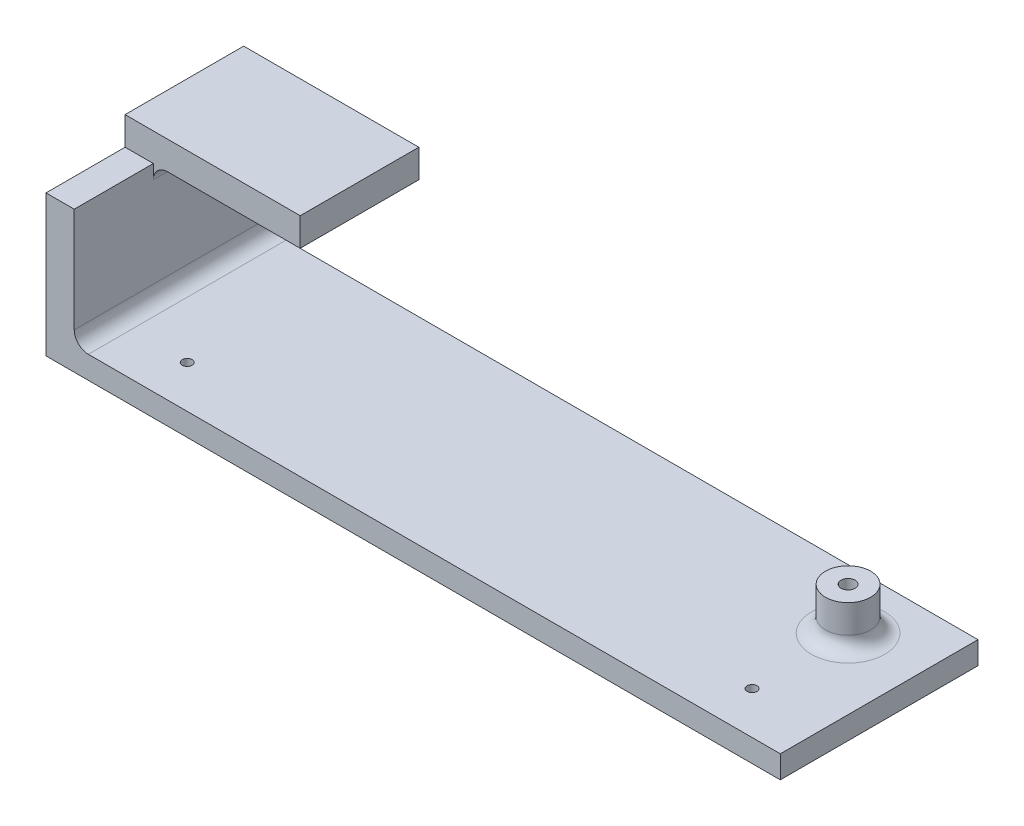
ISO-10303-21;
HEADER;
FILE_DESCRIPTION(('STEP AP214'),'2;1');
FILE_NAME('part.step','',(''),(''),'','','');
FILE_SCHEMA(('AUTOMOTIVE_DESIGN { 1 0 10303 214 1 1 1 1 }'));
ENDSEC;
DATA;
#1=APPLICATION_CONTEXT('core data for automotive mechanical design processes');
#2=APPLICATION_PROTOCOL_DEFINITION('international standard','automotive_design',2000,#1);
#3=PRODUCT_CONTEXT('',#1,'mechanical');
#4=PRODUCT('Part','Part','',(#3));
#5=PRODUCT_RELATED_PRODUCT_CATEGORY('part','',(#4));
#6=PRODUCT_DEFINITION_FORMATION('','',#4);
#7=PRODUCT_DEFINITION_CONTEXT('part definition',#1,'design');
#8=PRODUCT_DEFINITION('design','',#6,#7);
#9=PRODUCT_DEFINITION_SHAPE('','',#8);
#10=(LENGTH_UNIT() NAMED_UNIT(*) SI_UNIT(.MILLI.,.METRE.));
#11=(NAMED_UNIT(*) PLANE_ANGLE_UNIT() SI_UNIT($,.RADIAN.));
#12=(NAMED_UNIT(*) SI_UNIT($,.STERADIAN.) SOLID_ANGLE_UNIT());
#13=UNCERTAINTY_MEASURE_WITH_UNIT(LENGTH_MEASURE(1.E-05),#10,'distance_accuracy_value','');
#14=(GEOMETRIC_REPRESENTATION_CONTEXT(3) GLOBAL_UNCERTAINTY_ASSIGNED_CONTEXT((#13)) GLOBAL_UNIT_ASSIGNED_CONTEXT((#10,
#11,#12)) REPRESENTATION_CONTEXT('',''));
#15=CARTESIAN_POINT('',(0.,0.,0.));
#16=DIRECTION('',(0.,0.,1.));
#17=DIRECTION('',(1.,0.,0.));
#18=AXIS2_PLACEMENT_3D('',#15,#16,#17);
#19=CARTESIAN_POINT('',(0.,50.,0.));
#20=DIRECTION('',(0.,1.,0.));
#21=DIRECTION('',(0.,0.,1.));
#22=AXIS2_PLACEMENT_3D('',#19,#20,#21);
#23=PLANE('',#22);
#24=DIRECTION('',(0.,0.,1.));
#25=VECTOR('',#24,1.);
#26=CARTESIAN_POINT('',(0.,50.,0.));
#27=LINE('',#26,#25);
#28=CARTESIAN_POINT('',(0.,50.,-28.));
#29=VERTEX_POINT('',#28);
#30=CARTESIAN_POINT('',(0.,50.,0.));
#31=VERTEX_POINT('',#30);
#32=EDGE_CURVE('E187',#29,#31,#27,.T.);
#33=ORIENTED_EDGE('',*,*,#32,.F.);
#34=DIRECTION('',(-1.,0.,0.));
#35=VECTOR('',#34,1.);
#36=CARTESIAN_POINT('',(52.,50.,-28.));
#37=LINE('',#36,#35);
#38=CARTESIAN_POINT('',(-10.,50.,-28.));
#39=VERTEX_POINT('',#38);
#40=EDGE_CURVE('E177',#29,#39,#37,.T.);
#41=ORIENTED_EDGE('',*,*,#40,.T.);
#42=DIRECTION('',(0.,0.,-1.));
#43=VECTOR('',#42,1.);
#44=CARTESIAN_POINT('',(-10.,50.,-70.));
#45=LINE('',#44,#43);
#46=CARTESIAN_POINT('',(-10.,50.,0.));
#47=VERTEX_POINT('',#46);
#48=EDGE_CURVE('E183',#47,#39,#45,.T.);
#49=ORIENTED_EDGE('',*,*,#48,.F.);
#50=DIRECTION('',(-1.,0.,0.));
#51=VECTOR('',#50,1.);
#52=CARTESIAN_POINT('',(-10.,50.,0.));
#53=LINE('',#52,#51);
#54=EDGE_CURVE('E179',#31,#47,#53,.T.);
#55=ORIENTED_EDGE('',*,*,#54,.F.);
#56=EDGE_LOOP('',(#33,#41,#49,#55));
#57=FACE_BOUND('',#56,.T.);
#58=ADVANCED_FACE('F39',(#57),#23,.T.);
#59=CARTESIAN_POINT('',(0.,8.,0.));
#60=DIRECTION('',(0.,0.,-1.));
#61=DIRECTION('',(-1.,0.,0.));
#62=AXIS2_PLACEMENT_3D('',#59,#60,#61);
#63=PLANE('',#62);
#64=DIRECTION('',(1.,0.,0.));
#65=VECTOR('',#64,1.);
#66=CARTESIAN_POINT('',(0.,0.,0.));
#67=LINE('',#66,#65);
#68=CARTESIAN_POINT('',(-10.,0.,0.));
#69=VERTEX_POINT('',#68);
#70=CARTESIAN_POINT('',(250.,0.,0.));
#71=VERTEX_POINT('',#70);
#72=EDGE_CURVE('E214',#69,#71,#67,.T.);
#73=ORIENTED_EDGE('',*,*,#72,.T.);
#74=DIRECTION('',(0.,-1.,0.));
#75=VECTOR('',#74,1.);
#76=CARTESIAN_POINT('',(250.,8.,0.));
#77=LINE('',#76,#75);
#78=CARTESIAN_POINT('',(250.,8.,0.));
#79=VERTEX_POINT('',#78);
#80=EDGE_CURVE('E248',#79,#71,#77,.T.);
#81=ORIENTED_EDGE('',*,*,#80,.F.);
#82=DIRECTION('',(1.,0.,0.));
#83=VECTOR('',#82,1.);
#84=CARTESIAN_POINT('',(0.,8.,0.));
#85=LINE('',#84,#83);
#86=CARTESIAN_POINT('',(5.,8.,0.));
#87=VERTEX_POINT('',#86);
#88=EDGE_CURVE('E226',#87,#79,#85,.T.);
#89=ORIENTED_EDGE('',*,*,#88,.F.);
#90=CARTESIAN_POINT('',(5.,13.,0.));
#91=DIRECTION('',(0.,0.,-1.));
#92=DIRECTION('',(-1.,0.,0.));
#93=AXIS2_PLACEMENT_3D('',#90,#91,#92);
#94=CIRCLE('',#93,5.);
#95=CARTESIAN_POINT('',(0.,13.,0.));
#96=VERTEX_POINT('',#95);
#97=EDGE_CURVE('E268',#87,#96,#94,.T.);
#98=ORIENTED_EDGE('',*,*,#97,.T.);
#99=DIRECTION('',(0.,-1.,0.));
#100=VECTOR('',#99,1.);
#101=CARTESIAN_POINT('',(0.,50.,0.));
#102=LINE('',#101,#100);
#103=EDGE_CURVE('E194',#31,#96,#102,.T.);
#104=ORIENTED_EDGE('',*,*,#103,.F.);
#105=ORIENTED_EDGE('',*,*,#54,.T.);
#106=DIRECTION('',(0.,-1.,0.));
#107=VECTOR('',#106,1.);
#108=CARTESIAN_POINT('',(-10.,50.,0.));
#109=LINE('',#108,#107);
#110=EDGE_CURVE('E190',#47,#69,#109,.T.);
#111=ORIENTED_EDGE('',*,*,#110,.T.);
#112=EDGE_LOOP('',(#73,#81,#89,#98,#104,#105,#111));
#113=FACE_BOUND('',#112,.T.);
#114=ADVANCED_FACE('F297',(#113),#63,.F.);
#115=CARTESIAN_POINT('',(250.,8.,0.));
#116=DIRECTION('',(-1.,0.,0.));
#117=DIRECTION('',(0.,0.,1.));
#118=AXIS2_PLACEMENT_3D('',#115,#116,#117);
#119=PLANE('',#118);
#120=DIRECTION('',(0.,0.,-1.));
#121=VECTOR('',#120,1.);
#122=CARTESIAN_POINT('',(250.,0.,0.));
#123=LINE('',#122,#121);
#124=CARTESIAN_POINT('',(250.,0.,-70.));
#125=VERTEX_POINT('',#124);
#126=EDGE_CURVE('E240',#71,#125,#123,.T.);
#127=ORIENTED_EDGE('',*,*,#126,.T.);
#128=DIRECTION('',(0.,-1.,0.));
#129=VECTOR('',#128,1.);
#130=CARTESIAN_POINT('',(250.,8.,-70.));
#131=LINE('',#130,#129);
#132=CARTESIAN_POINT('',(250.,8.,-70.));
#133=VERTEX_POINT('',#132);
#134=EDGE_CURVE('E237',#133,#125,#131,.T.);
#135=ORIENTED_EDGE('',*,*,#134,.F.);
#136=DIRECTION('',(0.,0.,-1.));
#137=VECTOR('',#136,1.);
#138=CARTESIAN_POINT('',(250.,8.,0.));
#139=LINE('',#138,#137);
#140=EDGE_CURVE('E229',#79,#133,#139,.T.);
#141=ORIENTED_EDGE('',*,*,#140,.F.);
#142=ORIENTED_EDGE('',*,*,#80,.T.);
#143=EDGE_LOOP('',(#127,#135,#141,#142));
#144=FACE_BOUND('',#143,.T.);
#145=ADVANCED_FACE('F303',(#144),#119,.F.);
#146=CARTESIAN_POINT('',(0.,8.,-70.));
#147=DIRECTION('',(0.,0.,1.));
#148=DIRECTION('',(1.,0.,0.));
#149=AXIS2_PLACEMENT_3D('',#146,#147,#148);
#150=PLANE('',#149);
#151=DIRECTION('',(-1.,0.,0.));
#152=VECTOR('',#151,1.);
#153=CARTESIAN_POINT('',(0.,0.,-70.));
#154=LINE('',#153,#152);
#155=CARTESIAN_POINT('',(-10.,0.,-70.));
#156=VERTEX_POINT('',#155);
#157=EDGE_CURVE('E230',#125,#156,#154,.T.);
#158=ORIENTED_EDGE('',*,*,#157,.T.);
#159=DIRECTION('',(0.,-1.,0.));
#160=VECTOR('',#159,1.);
#161=CARTESIAN_POINT('',(-10.,50.,-70.));
#162=LINE('',#161,#160);
#163=CARTESIAN_POINT('',(-10.,60.,-70.));
#164=VERTEX_POINT('',#163);
#165=EDGE_CURVE('E203',#164,#156,#162,.T.);
#166=ORIENTED_EDGE('',*,*,#165,.F.);
#167=DIRECTION('',(-1.,0.,0.));
#168=VECTOR('',#167,1.);
#169=CARTESIAN_POINT('',(52.,60.,-70.));
#170=LINE('',#169,#168);
#171=CARTESIAN_POINT('',(52.,60.,-70.));
#172=VERTEX_POINT('',#171);
#173=EDGE_CURVE('E151',#172,#164,#170,.T.);
#174=ORIENTED_EDGE('',*,*,#173,.F.);
#175=DIRECTION('',(0.,-1.,0.));
#176=VECTOR('',#175,1.);
#177=CARTESIAN_POINT('',(52.,50.,-70.));
#178=LINE('',#177,#176);
#179=CARTESIAN_POINT('',(52.,50.,-70.));
#180=VERTEX_POINT('',#179);
#181=EDGE_CURVE('E143',#172,#180,#178,.T.);
#182=ORIENTED_EDGE('',*,*,#181,.T.);
#183=DIRECTION('',(-1.,0.,0.));
#184=VECTOR('',#183,1.);
#185=CARTESIAN_POINT('',(52.,50.,-70.));
#186=LINE('',#185,#184);
#187=CARTESIAN_POINT('',(5.,50.,-70.));
#188=VERTEX_POINT('',#187);
#189=EDGE_CURVE('E127',#180,#188,#186,.T.);
#190=ORIENTED_EDGE('',*,*,#189,.T.);
#191=CARTESIAN_POINT('',(5.,45.,-70.));
#192=DIRECTION('',(0.,0.,1.));
#193=DIRECTION('',(1.,0.,0.));
#194=AXIS2_PLACEMENT_3D('',#191,#192,#193);
#195=CIRCLE('',#194,5.);
#196=CARTESIAN_POINT('',(0.,45.,-70.));
#197=VERTEX_POINT('',#196);
#198=EDGE_CURVE('E276',#188,#197,#195,.T.);
#199=ORIENTED_EDGE('',*,*,#198,.T.);
#200=DIRECTION('',(0.,-1.,0.));
#201=VECTOR('',#200,1.);
#202=CARTESIAN_POINT('',(0.,50.,-70.));
#203=LINE('',#202,#201);
#204=CARTESIAN_POINT('',(0.,13.,-70.));
#205=VERTEX_POINT('',#204);
#206=EDGE_CURVE('E199',#197,#205,#203,.T.);
#207=ORIENTED_EDGE('',*,*,#206,.T.);
#208=CARTESIAN_POINT('',(5.,13.,-70.));
#209=DIRECTION('',(0.,0.,1.));
#210=DIRECTION('',(1.,0.,0.));
#211=AXIS2_PLACEMENT_3D('',#208,#209,#210);
#212=CIRCLE('',#211,5.);
#213=CARTESIAN_POINT('',(5.,8.,-70.));
#214=VERTEX_POINT('',#213);
#215=EDGE_CURVE('E271',#205,#214,#212,.T.);
#216=ORIENTED_EDGE('',*,*,#215,.T.);
#217=DIRECTION('',(-1.,0.,0.));
#218=VECTOR('',#217,1.);
#219=CARTESIAN_POINT('',(0.,8.,-70.));
#220=LINE('',#219,#218);
#221=EDGE_CURVE('E233',#133,#214,#220,.T.);
#222=ORIENTED_EDGE('',*,*,#221,.F.);
#223=ORIENTED_EDGE('',*,*,#134,.T.);
#224=EDGE_LOOP('',(#158,#166,#174,#182,#190,#199,#207,#216,#222,#223));
#225=FACE_BOUND('',#224,.T.);
#226=ADVANCED_FACE('F149',(#225),#150,.F.);
#227=CARTESIAN_POINT('',(0.,8.,0.));
#228=DIRECTION('',(0.,-1.,0.));
#229=DIRECTION('',(0.,0.,-1.));
#230=AXIS2_PLACEMENT_3D('',#227,#228,#229);
#231=PLANE('',#230);
#232=CARTESIAN_POINT('',(225.,8.,-49.));
#233=DIRECTION('',(0.,-1.,0.));
#234=DIRECTION('',(0.,0.,-1.));
#235=AXIS2_PLACEMENT_3D('',#232,#233,#234);
#236=CIRCLE('',#235,13.);
#237=CARTESIAN_POINT('',(225.,8.,-62.));
#238=VERTEX_POINT('',#237);
#239=EDGE_CURVE('E11',#238,#238,#236,.T.);
#240=ORIENTED_EDGE('',*,*,#239,.T.);
#241=EDGE_LOOP('',(#240));
#242=FACE_BOUND('',#241,.T.);
#243=CARTESIAN_POINT('',(25.,8.,-15.));
#244=DIRECTION('',(0.,1.,0.));
#245=DIRECTION('',(0.,0.,1.));
#246=AXIS2_PLACEMENT_3D('',#243,#244,#245);
#247=CIRCLE('',#246,1.75);
#248=CARTESIAN_POINT('',(25.,8.,-13.25));
#249=VERTEX_POINT('',#248);
#250=EDGE_CURVE('E215',#249,#249,#247,.T.);
#251=ORIENTED_EDGE('',*,*,#250,.F.);
#252=EDGE_LOOP('',(#251));
#253=FACE_BOUND('',#252,.T.);
#254=CARTESIAN_POINT('',(225.,8.,-15.));
#255=DIRECTION('',(0.,1.,0.));
#256=DIRECTION('',(0.,0.,1.));
#257=AXIS2_PLACEMENT_3D('',#254,#255,#256);
#258=CIRCLE('',#257,1.75000000000001);
#259=CARTESIAN_POINT('',(225.,8.,-13.25));
#260=VERTEX_POINT('',#259);
#261=EDGE_CURVE('E198',#260,#260,#258,.T.);
#262=ORIENTED_EDGE('',*,*,#261,.F.);
#263=EDGE_LOOP('',(#262));
#264=FACE_BOUND('',#263,.T.);
#265=ORIENTED_EDGE('',*,*,#221,.T.);
#266=DIRECTION('',(0.,0.,1.));
#267=VECTOR('',#266,1.);
#268=CARTESIAN_POINT('',(5.,8.,0.));
#269=LINE('',#268,#267);
#270=EDGE_CURVE('E252',#214,#87,#269,.T.);
#271=ORIENTED_EDGE('',*,*,#270,.T.);
#272=ORIENTED_EDGE('',*,*,#88,.T.);
#273=ORIENTED_EDGE('',*,*,#140,.T.);
#274=EDGE_LOOP('',(#265,#271,#272,#273));
#275=FACE_BOUND('',#274,.T.);
#276=ADVANCED_FACE('F294',(#242,#253,#264,#275),#231,.F.);
#277=CARTESIAN_POINT('',(0.,0.,0.));
#278=DIRECTION('',(0.,-1.,0.));
#279=DIRECTION('',(0.,0.,-1.));
#280=AXIS2_PLACEMENT_3D('',#277,#278,#279);
#281=PLANE('',#280);
#282=CARTESIAN_POINT('',(25.,0.,-15.));
#283=DIRECTION('',(0.,1.,0.));
#284=DIRECTION('',(0.,0.,1.));
#285=AXIS2_PLACEMENT_3D('',#282,#283,#284);
#286=CIRCLE('',#285,1.75);
#287=CARTESIAN_POINT('',(25.,0.,-13.25));
#288=VERTEX_POINT('',#287);
#289=EDGE_CURVE('E210',#288,#288,#286,.T.);
#290=ORIENTED_EDGE('',*,*,#289,.T.);
#291=EDGE_LOOP('',(#290));
#292=FACE_BOUND('',#291,.T.);
#293=CARTESIAN_POINT('',(225.,0.,-15.));
#294=DIRECTION('',(0.,1.,0.));
#295=DIRECTION('',(0.,0.,1.));
#296=AXIS2_PLACEMENT_3D('',#293,#294,#295);
#297=CIRCLE('',#296,1.75000000000001);
#298=CARTESIAN_POINT('',(225.,0.,-13.25));
#299=VERTEX_POINT('',#298);
#300=EDGE_CURVE('E219',#299,#299,#297,.T.);
#301=ORIENTED_EDGE('',*,*,#300,.T.);
#302=EDGE_LOOP('',(#301));
#303=FACE_BOUND('',#302,.T.);
#304=ORIENTED_EDGE('',*,*,#72,.F.);
#305=DIRECTION('',(0.,0.,-1.));
#306=VECTOR('',#305,1.);
#307=CARTESIAN_POINT('',(-10.,0.,-70.));
#308=LINE('',#307,#306);
#309=EDGE_CURVE('E172',#69,#156,#308,.T.);
#310=ORIENTED_EDGE('',*,*,#309,.T.);
#311=ORIENTED_EDGE('',*,*,#157,.F.);
#312=ORIENTED_EDGE('',*,*,#126,.F.);
#313=EDGE_LOOP('',(#304,#310,#311,#312));
#314=FACE_BOUND('',#313,.T.);
#315=ADVANCED_FACE('F324',(#292,#303,#314),#281,.T.);
#316=CARTESIAN_POINT('',(225.,0.,-15.));
#317=DIRECTION('',(0.,1.,0.));
#318=DIRECTION('',(0.,0.,1.));
#319=AXIS2_PLACEMENT_3D('',#316,#317,#318);
#320=CYLINDRICAL_SURFACE('',#319,1.75000000000001);
#321=ORIENTED_EDGE('',*,*,#300,.F.);
#322=EDGE_LOOP('',(#321));
#323=FACE_BOUND('',#322,.T.);
#324=ORIENTED_EDGE('',*,*,#261,.T.);
#325=EDGE_LOOP('',(#324));
#326=FACE_BOUND('',#325,.T.);
#327=ADVANCED_FACE('F321',(#323,#326),#320,.F.);
#328=CARTESIAN_POINT('',(25.,0.,-15.));
#329=DIRECTION('',(0.,1.,0.));
#330=DIRECTION('',(0.,0.,1.));
#331=AXIS2_PLACEMENT_3D('',#328,#329,#330);
#332=CYLINDRICAL_SURFACE('',#331,1.75);
#333=ORIENTED_EDGE('',*,*,#289,.F.);
#334=EDGE_LOOP('',(#333));
#335=FACE_BOUND('',#334,.T.);
#336=ORIENTED_EDGE('',*,*,#250,.T.);
#337=EDGE_LOOP('',(#336));
#338=FACE_BOUND('',#337,.T.);
#339=ADVANCED_FACE('F314',(#335,#338),#332,.F.);
#340=CARTESIAN_POINT('',(0.,50.,0.));
#341=DIRECTION('',(1.,0.,0.));
#342=DIRECTION('',(0.,0.,-1.));
#343=AXIS2_PLACEMENT_3D('',#340,#341,#342);
#344=PLANE('',#343);
#345=ORIENTED_EDGE('',*,*,#103,.T.);
#346=DIRECTION('',(0.,0.,1.));
#347=VECTOR('',#346,1.);
#348=CARTESIAN_POINT('',(0.,13.,0.));
#349=LINE('',#348,#347);
#350=EDGE_CURVE('E263',#96,#205,#349,.F.);
#351=ORIENTED_EDGE('',*,*,#350,.T.);
#352=ORIENTED_EDGE('',*,*,#206,.F.);
#353=DIRECTION('',(0.,0.,1.));
#354=VECTOR('',#353,1.);
#355=CARTESIAN_POINT('',(0.,45.,-28.));
#356=LINE('',#355,#354);
#357=CARTESIAN_POINT('',(0.,45.,-28.));
#358=VERTEX_POINT('',#357);
#359=EDGE_CURVE('E259',#197,#358,#356,.T.);
#360=ORIENTED_EDGE('',*,*,#359,.T.);
#361=DIRECTION('',(0.,1.,0.));
#362=VECTOR('',#361,1.);
#363=CARTESIAN_POINT('',(0.,50.,-28.));
#364=LINE('',#363,#362);
#365=EDGE_CURVE('E256',#358,#29,#364,.T.);
#366=ORIENTED_EDGE('',*,*,#365,.T.);
#367=ORIENTED_EDGE('',*,*,#32,.T.);
#368=EDGE_LOOP('',(#345,#351,#352,#360,#366,#367));
#369=FACE_BOUND('',#368,.T.);
#370=ADVANCED_FACE('F310',(#369),#344,.T.);
#371=CARTESIAN_POINT('',(-10.,50.,-70.));
#372=DIRECTION('',(-1.,0.,0.));
#373=DIRECTION('',(0.,0.,1.));
#374=AXIS2_PLACEMENT_3D('',#371,#372,#373);
#375=PLANE('',#374);
#376=ORIENTED_EDGE('',*,*,#309,.F.);
#377=ORIENTED_EDGE('',*,*,#110,.F.);
#378=ORIENTED_EDGE('',*,*,#48,.T.);
#379=DIRECTION('',(0.,1.,0.));
#380=VECTOR('',#379,1.);
#381=CARTESIAN_POINT('',(-10.,50.,-28.));
#382=LINE('',#381,#380);
#383=CARTESIAN_POINT('',(-10.,60.,-28.));
#384=VERTEX_POINT('',#383);
#385=EDGE_CURVE('E157',#39,#384,#382,.T.);
#386=ORIENTED_EDGE('',*,*,#385,.T.);
#387=DIRECTION('',(0.,0.,-1.));
#388=VECTOR('',#387,1.);
#389=CARTESIAN_POINT('',(-10.,60.,-70.));
#390=LINE('',#389,#388);
#391=EDGE_CURVE('E153',#384,#164,#390,.T.);
#392=ORIENTED_EDGE('',*,*,#391,.T.);
#393=ORIENTED_EDGE('',*,*,#165,.T.);
#394=EDGE_LOOP('',(#376,#377,#378,#386,#392,#393));
#395=FACE_BOUND('',#394,.T.);
#396=ADVANCED_FACE('F313',(#395),#375,.T.);
#397=CARTESIAN_POINT('',(52.,50.,-70.));
#398=DIRECTION('',(0.,-1.,0.));
#399=DIRECTION('',(0.,0.,-1.));
#400=AXIS2_PLACEMENT_3D('',#397,#398,#399);
#401=PLANE('',#400);
#402=CARTESIAN_POINT('',(52.,50.,-28.));
#403=VERTEX_POINT('',#402);
#404=CARTESIAN_POINT('',(5.,50.,-28.));
#405=VERTEX_POINT('',#404);
#406=EDGE_CURVE('E135',#403,#405,#37,.T.);
#407=ORIENTED_EDGE('',*,*,#406,.T.);
#408=DIRECTION('',(0.,0.,1.));
#409=VECTOR('',#408,1.);
#410=CARTESIAN_POINT('',(5.,50.,-70.));
#411=LINE('',#410,#409);
#412=EDGE_CURVE('E62',#405,#188,#411,.F.);
#413=ORIENTED_EDGE('',*,*,#412,.T.);
#414=ORIENTED_EDGE('',*,*,#189,.F.);
#415=DIRECTION('',(0.,0.,1.));
#416=VECTOR('',#415,1.);
#417=CARTESIAN_POINT('',(52.,50.,-70.));
#418=LINE('',#417,#416);
#419=EDGE_CURVE('E130',#180,#403,#418,.T.);
#420=ORIENTED_EDGE('',*,*,#419,.T.);
#421=EDGE_LOOP('',(#407,#413,#414,#420));
#422=FACE_BOUND('',#421,.T.);
#423=ADVANCED_FACE('F129',(#422),#401,.T.);
#424=CARTESIAN_POINT('',(52.,60.,-70.));
#425=DIRECTION('',(0.,1.,0.));
#426=DIRECTION('',(0.,0.,1.));
#427=AXIS2_PLACEMENT_3D('',#424,#425,#426);
#428=PLANE('',#427);
#429=ORIENTED_EDGE('',*,*,#391,.F.);
#430=DIRECTION('',(-1.,0.,0.));
#431=VECTOR('',#430,1.);
#432=CARTESIAN_POINT('',(52.,60.,-28.));
#433=LINE('',#432,#431);
#434=CARTESIAN_POINT('',(52.,60.,-28.));
#435=VERTEX_POINT('',#434);
#436=EDGE_CURVE('E173',#435,#384,#433,.T.);
#437=ORIENTED_EDGE('',*,*,#436,.F.);
#438=DIRECTION('',(0.,0.,-1.));
#439=VECTOR('',#438,1.);
#440=CARTESIAN_POINT('',(52.,60.,-70.));
#441=LINE('',#440,#439);
#442=EDGE_CURVE('E136',#435,#172,#441,.T.);
#443=ORIENTED_EDGE('',*,*,#442,.T.);
#444=ORIENTED_EDGE('',*,*,#173,.T.);
#445=EDGE_LOOP('',(#429,#437,#443,#444));
#446=FACE_BOUND('',#445,.T.);
#447=ADVANCED_FACE('F368',(#446),#428,.T.);
#448=CARTESIAN_POINT('',(52.,50.,-28.));
#449=DIRECTION('',(0.,0.,1.));
#450=DIRECTION('',(1.,0.,0.));
#451=AXIS2_PLACEMENT_3D('',#448,#449,#450);
#452=PLANE('',#451);
#453=ORIENTED_EDGE('',*,*,#385,.F.);
#454=ORIENTED_EDGE('',*,*,#40,.F.);
#455=ORIENTED_EDGE('',*,*,#365,.F.);
#456=CARTESIAN_POINT('',(5.,45.,-28.));
#457=DIRECTION('',(0.,0.,1.));
#458=DIRECTION('',(1.,0.,0.));
#459=AXIS2_PLACEMENT_3D('',#456,#457,#458);
#460=CIRCLE('',#459,5.);
#461=EDGE_CURVE('E55',#358,#405,#460,.F.);
#462=ORIENTED_EDGE('',*,*,#461,.T.);
#463=ORIENTED_EDGE('',*,*,#406,.F.);
#464=DIRECTION('',(0.,1.,0.));
#465=VECTOR('',#464,1.);
#466=CARTESIAN_POINT('',(52.,50.,-28.));
#467=LINE('',#466,#465);
#468=EDGE_CURVE('E146',#403,#435,#467,.T.);
#469=ORIENTED_EDGE('',*,*,#468,.T.);
#470=ORIENTED_EDGE('',*,*,#436,.T.);
#471=EDGE_LOOP('',(#453,#454,#455,#462,#463,#469,#470));
#472=FACE_BOUND('',#471,.T.);
#473=ADVANCED_FACE('F369',(#472),#452,.T.);
#474=CARTESIAN_POINT('',(52.,0.,0.));
#475=DIRECTION('',(1.,0.,0.));
#476=DIRECTION('',(0.,0.,-1.));
#477=AXIS2_PLACEMENT_3D('',#474,#475,#476);
#478=PLANE('',#477);
#479=ORIENTED_EDGE('',*,*,#181,.F.);
#480=ORIENTED_EDGE('',*,*,#442,.F.);
#481=ORIENTED_EDGE('',*,*,#468,.F.);
#482=ORIENTED_EDGE('',*,*,#419,.F.);
#483=EDGE_LOOP('',(#479,#480,#481,#482));
#484=FACE_BOUND('',#483,.T.);
#485=ADVANCED_FACE('F141',(#484),#478,.T.);
#486=CARTESIAN_POINT('',(5.,13.,0.));
#487=DIRECTION('',(0.,0.,1.));
#488=DIRECTION('',(1.,0.,0.));
#489=AXIS2_PLACEMENT_3D('',#486,#487,#488);
#490=CYLINDRICAL_SURFACE('',#489,5.);
#491=ORIENTED_EDGE('',*,*,#215,.F.);
#492=ORIENTED_EDGE('',*,*,#350,.F.);
#493=ORIENTED_EDGE('',*,*,#97,.F.);
#494=ORIENTED_EDGE('',*,*,#270,.F.);
#495=EDGE_LOOP('',(#491,#492,#493,#494));
#496=FACE_BOUND('',#495,.T.);
#497=ADVANCED_FACE('F337',(#496),#490,.F.);
#498=CARTESIAN_POINT('',(5.,45.,0.));
#499=DIRECTION('',(0.,0.,-1.));
#500=DIRECTION('',(-1.,0.,0.));
#501=AXIS2_PLACEMENT_3D('',#498,#499,#500);
#502=CYLINDRICAL_SURFACE('',#501,5.);
#503=ORIENTED_EDGE('',*,*,#198,.F.);
#504=ORIENTED_EDGE('',*,*,#412,.F.);
#505=ORIENTED_EDGE('',*,*,#461,.F.);
#506=ORIENTED_EDGE('',*,*,#359,.F.);
#507=EDGE_LOOP('',(#503,#504,#505,#506));
#508=FACE_BOUND('',#507,.T.);
#509=ADVANCED_FACE('F339',(#508),#502,.F.);
#510=CARTESIAN_POINT('',(225.,23.,-49.));
#511=DIRECTION('',(0.,1.,0.));
#512=DIRECTION('',(0.,0.,1.));
#513=AXIS2_PLACEMENT_3D('',#510,#511,#512);
#514=PLANE('',#513);
#515=CARTESIAN_POINT('',(225.,23.,-49.));
#516=DIRECTION('',(0.,1.,0.));
#517=DIRECTION('',(0.,0.,1.));
#518=AXIS2_PLACEMENT_3D('',#515,#516,#517);
#519=CIRCLE('',#518,8.00000000000001);
#520=CARTESIAN_POINT('',(225.,23.,-41.));
#521=VERTEX_POINT('',#520);
#522=EDGE_CURVE('E160',#521,#521,#519,.T.);
#523=ORIENTED_EDGE('',*,*,#522,.T.);
#524=EDGE_LOOP('',(#523));
#525=FACE_BOUND('',#524,.T.);
#526=CARTESIAN_POINT('',(225.,23.,-49.));
#527=DIRECTION('',(0.,1.,0.));
#528=DIRECTION('',(0.,0.,1.));
#529=AXIS2_PLACEMENT_3D('',#526,#527,#528);
#530=CIRCLE('',#529,2.5);
#531=CARTESIAN_POINT('',(225.,23.,-46.5));
#532=VERTEX_POINT('',#531);
#533=EDGE_CURVE('E389',#532,#532,#530,.T.);
#534=ORIENTED_EDGE('',*,*,#533,.F.);
#535=EDGE_LOOP('',(#534));
#536=FACE_BOUND('',#535,.T.);
#537=ADVANCED_FACE('F342',(#525,#536),#514,.T.);
#538=CARTESIAN_POINT('',(225.,23.,-49.));
#539=DIRECTION('',(0.,-1.,0.));
#540=DIRECTION('',(0.,0.,-1.));
#541=AXIS2_PLACEMENT_3D('',#538,#539,#540);
#542=CYLINDRICAL_SURFACE('',#541,8.00000000000001);
#543=CARTESIAN_POINT('',(225.,13.,-49.));
#544=DIRECTION('',(0.,-1.,0.));
#545=DIRECTION('',(0.,0.,-1.));
#546=AXIS2_PLACEMENT_3D('',#543,#544,#545);
#547=CIRCLE('',#546,8.00000000000001);
#548=CARTESIAN_POINT('',(225.,13.,-57.));
#549=VERTEX_POINT('',#548);
#550=EDGE_CURVE('E48',#549,#549,#547,.F.);
#551=ORIENTED_EDGE('',*,*,#550,.T.);
#552=EDGE_LOOP('',(#551));
#553=FACE_BOUND('',#552,.T.);
#554=ORIENTED_EDGE('',*,*,#522,.F.);
#555=EDGE_LOOP('',(#554));
#556=FACE_BOUND('',#555,.T.);
#557=ADVANCED_FACE('F282',(#553,#556),#542,.T.);
#558=CARTESIAN_POINT('',(225.,23.,-49.));
#559=DIRECTION('',(0.,-1.,0.));
#560=DIRECTION('',(0.,0.,-1.));
#561=AXIS2_PLACEMENT_3D('',#558,#559,#560);
#562=CYLINDRICAL_SURFACE('',#561,2.5);
#563=ORIENTED_EDGE('',*,*,#533,.T.);
#564=EDGE_LOOP('',(#563));
#565=FACE_BOUND('',#564,.T.);
#566=CARTESIAN_POINT('',(225.,8.,-49.));
#567=DIRECTION('',(0.,1.,0.));
#568=DIRECTION('',(0.,0.,1.));
#569=AXIS2_PLACEMENT_3D('',#566,#567,#568);
#570=CIRCLE('',#569,2.5);
#571=CARTESIAN_POINT('',(225.,8.,-46.5));
#572=VERTEX_POINT('',#571);
#573=EDGE_CURVE('E392',#572,#572,#570,.T.);
#574=ORIENTED_EDGE('',*,*,#573,.F.);
#575=EDGE_LOOP('',(#574));
#576=FACE_BOUND('',#575,.T.);
#577=ADVANCED_FACE('F291',(#565,#576),#562,.F.);
#578=ORIENTED_EDGE('',*,*,#573,.T.);
#579=EDGE_LOOP('',(#578));
#580=FACE_BOUND('',#579,.T.);
#581=ADVANCED_FACE('F286',(#580),#231,.F.);
#582=CARTESIAN_POINT('',(225.,13.,-49.));
#583=DIRECTION('',(0.,-1.,0.));
#584=DIRECTION('',(0.,0.,-1.));
#585=AXIS2_PLACEMENT_3D('',#582,#583,#584);
#586=TOROIDAL_SURFACE('',#585,13.,5.);
#587=ORIENTED_EDGE('',*,*,#239,.F.);
#588=EDGE_LOOP('',(#587));
#589=FACE_BOUND('',#588,.T.);
#590=ORIENTED_EDGE('',*,*,#550,.F.);
#591=EDGE_LOOP('',(#590));
#592=FACE_BOUND('',#591,.T.);
#593=ADVANCED_FACE('F41',(#589,#592),#586,.F.);
#594=CLOSED_SHELL('',(#58,#114,#145,#226,#276,#315,#327,#339,#370,#396,#423,#447,#473,#485,#497,
#509,#537,#557,#577,#581,#593));
#595=MANIFOLD_SOLID_BREP('B2',#594);
#596=ADVANCED_BREP_SHAPE_REPRESENTATION('',(#18,#595),#14);
#597=SHAPE_DEFINITION_REPRESENTATION(#9,#596);
ENDSEC;
END-ISO-10303-21;
